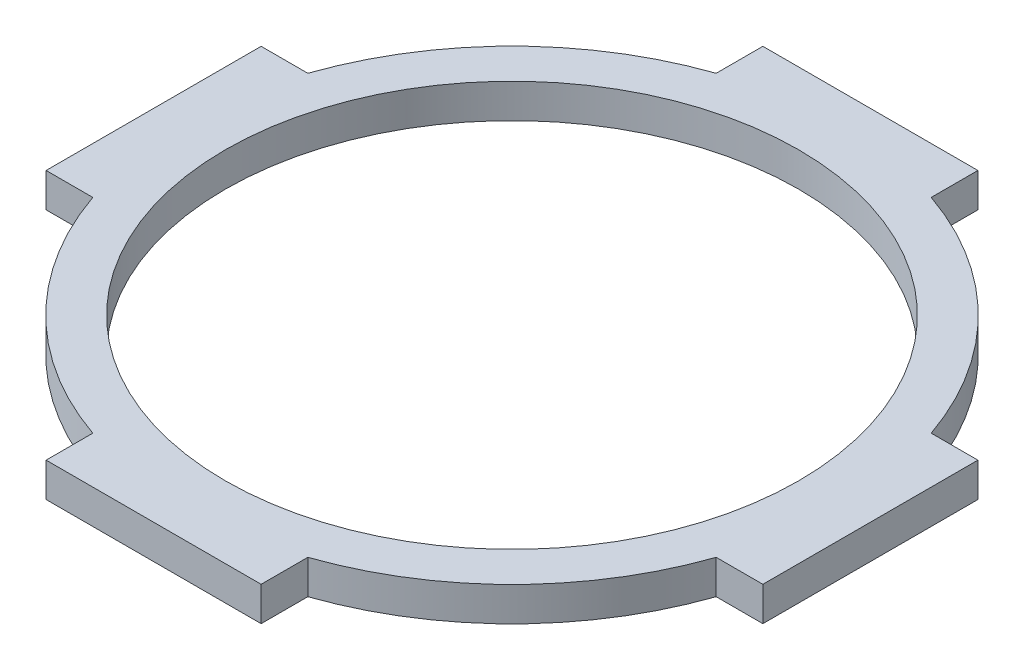
ISO-10303-21;
HEADER;
FILE_DESCRIPTION(('STEP AP214'),'2;1');
FILE_NAME('part.step','',(''),(''),'','','');
FILE_SCHEMA(('AUTOMOTIVE_DESIGN { 1 0 10303 214 1 1 1 1 }'));
ENDSEC;
DATA;
#1=APPLICATION_CONTEXT('core data for automotive mechanical design processes');
#2=APPLICATION_PROTOCOL_DEFINITION('international standard','automotive_design',2000,#1);
#3=PRODUCT_CONTEXT('',#1,'mechanical');
#4=PRODUCT('Part','Part','',(#3));
#5=PRODUCT_RELATED_PRODUCT_CATEGORY('part','',(#4));
#6=PRODUCT_DEFINITION_FORMATION('','',#4);
#7=PRODUCT_DEFINITION_CONTEXT('part definition',#1,'design');
#8=PRODUCT_DEFINITION('design','',#6,#7);
#9=PRODUCT_DEFINITION_SHAPE('','',#8);
#10=(LENGTH_UNIT() NAMED_UNIT(*) SI_UNIT(.MILLI.,.METRE.));
#11=(NAMED_UNIT(*) PLANE_ANGLE_UNIT() SI_UNIT($,.RADIAN.));
#12=(NAMED_UNIT(*) SI_UNIT($,.STERADIAN.) SOLID_ANGLE_UNIT());
#13=UNCERTAINTY_MEASURE_WITH_UNIT(LENGTH_MEASURE(1.E-05),#10,'distance_accuracy_value','');
#14=(GEOMETRIC_REPRESENTATION_CONTEXT(3) GLOBAL_UNCERTAINTY_ASSIGNED_CONTEXT((#13)) GLOBAL_UNIT_ASSIGNED_CONTEXT((#10,
#11,#12)) REPRESENTATION_CONTEXT('',''));
#15=CARTESIAN_POINT('',(0.,0.,0.));
#16=DIRECTION('',(0.,0.,1.));
#17=DIRECTION('',(1.,0.,0.));
#18=AXIS2_PLACEMENT_3D('',#15,#16,#17);
#19=CARTESIAN_POINT('',(0.,4.7625,0.));
#20=DIRECTION('',(0.,-1.,0.));
#21=DIRECTION('',(0.,0.,-1.));
#22=AXIS2_PLACEMENT_3D('',#19,#20,#21);
#23=CYLINDRICAL_SURFACE('',#22,46.);
#24=CARTESIAN_POINT('',(0.,4.7625,0.));
#25=DIRECTION('',(0.,1.,0.));
#26=DIRECTION('',(0.,0.,1.));
#27=AXIS2_PLACEMENT_3D('',#24,#25,#26);
#28=CIRCLE('',#27,46.);
#29=CARTESIAN_POINT('',(14.9999999999995,4.7625,43.485629810318));
#30=VERTEX_POINT('',#29);
#31=CARTESIAN_POINT('',(43.4856298103178,4.7625,15.));
#32=VERTEX_POINT('',#31);
#33=EDGE_CURVE('E43',#30,#32,#28,.T.);
#34=ORIENTED_EDGE('',*,*,#33,.F.);
#35=DIRECTION('',(0.,1.,0.));
#36=VECTOR('',#35,1.);
#37=CARTESIAN_POINT('',(14.9999999999995,-30.6991371046195,43.485629810318));
#38=LINE('',#37,#36);
#39=CARTESIAN_POINT('',(14.9999999999995,0.,43.485629810318));
#40=VERTEX_POINT('',#39);
#41=EDGE_CURVE('E178',#40,#30,#38,.T.);
#42=ORIENTED_EDGE('',*,*,#41,.F.);
#43=CARTESIAN_POINT('',(0.,0.,0.));
#44=DIRECTION('',(0.,1.,0.));
#45=DIRECTION('',(0.,0.,1.));
#46=AXIS2_PLACEMENT_3D('',#43,#44,#45);
#47=CIRCLE('',#46,46.);
#48=CARTESIAN_POINT('',(43.4856298103178,0.,15.));
#49=VERTEX_POINT('',#48);
#50=EDGE_CURVE('E315',#40,#49,#47,.T.);
#51=ORIENTED_EDGE('',*,*,#50,.T.);
#52=DIRECTION('',(0.,1.,0.));
#53=VECTOR('',#52,1.);
#54=CARTESIAN_POINT('',(43.4856298103178,-30.6991371046194,15.));
#55=LINE('',#54,#53);
#56=EDGE_CURVE('E199',#49,#32,#55,.T.);
#57=ORIENTED_EDGE('',*,*,#56,.T.);
#58=EDGE_LOOP('',(#34,#42,#51,#57));
#59=FACE_BOUND('',#58,.T.);
#60=ADVANCED_FACE('F34',(#59),#23,.T.);
#61=CARTESIAN_POINT('',(43.4856298103178,4.7625,-15.));
#62=VERTEX_POINT('',#61);
#63=CARTESIAN_POINT('',(15.0000000000002,4.7625,-43.4856298103177));
#64=VERTEX_POINT('',#63);
#65=EDGE_CURVE('E296',#62,#64,#28,.T.);
#66=ORIENTED_EDGE('',*,*,#65,.F.);
#67=DIRECTION('',(0.,1.,0.));
#68=VECTOR('',#67,1.);
#69=CARTESIAN_POINT('',(43.4856298103178,-30.6991371046194,-15.));
#70=LINE('',#69,#68);
#71=CARTESIAN_POINT('',(43.4856298103178,0.,-15.));
#72=VERTEX_POINT('',#71);
#73=EDGE_CURVE('E188',#72,#62,#70,.T.);
#74=ORIENTED_EDGE('',*,*,#73,.F.);
#75=CARTESIAN_POINT('',(15.0000000000002,0.,-43.4856298103177));
#76=VERTEX_POINT('',#75);
#77=EDGE_CURVE('E313',#72,#76,#47,.T.);
#78=ORIENTED_EDGE('',*,*,#77,.T.);
#79=DIRECTION('',(0.,1.,0.));
#80=VECTOR('',#79,1.);
#81=CARTESIAN_POINT('',(15.0000000000002,-30.6991371046194,-43.4856298103177));
#82=LINE('',#81,#80);
#83=EDGE_CURVE('E224',#76,#64,#82,.T.);
#84=ORIENTED_EDGE('',*,*,#83,.T.);
#85=EDGE_LOOP('',(#66,#74,#78,#84));
#86=FACE_BOUND('',#85,.T.);
#87=ADVANCED_FACE('F286',(#86),#23,.T.);
#88=CARTESIAN_POINT('',(-14.9999999999998,4.7625,-43.4856298103179));
#89=VERTEX_POINT('',#88);
#90=CARTESIAN_POINT('',(-43.4856298103178,4.7625,-15.));
#91=VERTEX_POINT('',#90);
#92=EDGE_CURVE('E44',#89,#91,#28,.T.);
#93=ORIENTED_EDGE('',*,*,#92,.F.);
#94=DIRECTION('',(0.,1.,0.));
#95=VECTOR('',#94,1.);
#96=CARTESIAN_POINT('',(-14.9999999999998,-30.6991371046194,-43.4856298103179));
#97=LINE('',#96,#95);
#98=CARTESIAN_POINT('',(-14.9999999999998,0.,-43.4856298103179));
#99=VERTEX_POINT('',#98);
#100=EDGE_CURVE('E213',#99,#89,#97,.T.);
#101=ORIENTED_EDGE('',*,*,#100,.F.);
#102=CARTESIAN_POINT('',(-43.4856298103178,0.,-15.));
#103=VERTEX_POINT('',#102);
#104=EDGE_CURVE('E264',#99,#103,#47,.T.);
#105=ORIENTED_EDGE('',*,*,#104,.T.);
#106=DIRECTION('',(0.,1.,0.));
#107=VECTOR('',#106,1.);
#108=CARTESIAN_POINT('',(-43.4856298103178,-30.6991371046194,-15.));
#109=LINE('',#108,#107);
#110=EDGE_CURVE('E249',#103,#91,#109,.T.);
#111=ORIENTED_EDGE('',*,*,#110,.T.);
#112=EDGE_LOOP('',(#93,#101,#105,#111));
#113=FACE_BOUND('',#112,.T.);
#114=ADVANCED_FACE('F282',(#113),#23,.T.);
#115=CARTESIAN_POINT('',(0.,4.7625,0.));
#116=DIRECTION('',(0.,1.,0.));
#117=DIRECTION('',(0.,0.,1.));
#118=AXIS2_PLACEMENT_3D('',#115,#116,#117);
#119=PLANE('',#118);
#120=CARTESIAN_POINT('',(-43.4856298103178,4.7625,15.));
#121=VERTEX_POINT('',#120);
#122=CARTESIAN_POINT('',(-15.0000000000005,4.7625,43.4856298103176));
#123=VERTEX_POINT('',#122);
#124=EDGE_CURVE('E11',#121,#123,#28,.T.);
#125=ORIENTED_EDGE('',*,*,#124,.T.);
#126=DIRECTION('',(0.,0.,1.));
#127=VECTOR('',#126,1.);
#128=CARTESIAN_POINT('',(-15.0000000000005,4.7625,43.4856298103176));
#129=LINE('',#128,#127);
#130=CARTESIAN_POINT('',(-15.0000000000005,4.7625,49.9999999999998));
#131=VERTEX_POINT('',#130);
#132=EDGE_CURVE('E153',#123,#131,#129,.T.);
#133=ORIENTED_EDGE('',*,*,#132,.T.);
#134=DIRECTION('',(1.,0.,0.));
#135=VECTOR('',#134,1.);
#136=CARTESIAN_POINT('',(-15.0000000000005,4.7625,49.9999999999998));
#137=LINE('',#136,#135);
#138=CARTESIAN_POINT('',(14.9999999999995,4.7625,50.0000000000002));
#139=VERTEX_POINT('',#138);
#140=EDGE_CURVE('E161',#131,#139,#137,.T.);
#141=ORIENTED_EDGE('',*,*,#140,.T.);
#142=DIRECTION('',(0.,0.,-1.));
#143=VECTOR('',#142,1.);
#144=CARTESIAN_POINT('',(14.9999999999995,4.7625,50.0000000000002));
#145=LINE('',#144,#143);
#146=EDGE_CURVE('E167',#139,#30,#145,.T.);
#147=ORIENTED_EDGE('',*,*,#146,.T.);
#148=ORIENTED_EDGE('',*,*,#33,.T.);
#149=DIRECTION('',(1.,0.,0.));
#150=VECTOR('',#149,1.);
#151=CARTESIAN_POINT('',(43.4856298103178,4.7625,15.));
#152=LINE('',#151,#150);
#153=CARTESIAN_POINT('',(50.,4.7625,15.));
#154=VERTEX_POINT('',#153);
#155=EDGE_CURVE('E184',#32,#154,#152,.T.);
#156=ORIENTED_EDGE('',*,*,#155,.T.);
#157=DIRECTION('',(0.,0.,-1.));
#158=VECTOR('',#157,1.);
#159=CARTESIAN_POINT('',(50.,4.7625,15.));
#160=LINE('',#159,#158);
#161=CARTESIAN_POINT('',(50.,4.7625,-15.));
#162=VERTEX_POINT('',#161);
#163=EDGE_CURVE('E193',#154,#162,#160,.T.);
#164=ORIENTED_EDGE('',*,*,#163,.T.);
#165=DIRECTION('',(-1.,0.,0.));
#166=VECTOR('',#165,1.);
#167=CARTESIAN_POINT('',(50.,4.7625,-15.));
#168=LINE('',#167,#166);
#169=EDGE_CURVE('E196',#162,#62,#168,.T.);
#170=ORIENTED_EDGE('',*,*,#169,.T.);
#171=ORIENTED_EDGE('',*,*,#65,.T.);
#172=DIRECTION('',(0.,0.,-1.));
#173=VECTOR('',#172,1.);
#174=CARTESIAN_POINT('',(15.0000000000002,4.7625,-43.4856298103177));
#175=LINE('',#174,#173);
#176=CARTESIAN_POINT('',(15.0000000000002,4.7625,-50.));
#177=VERTEX_POINT('',#176);
#178=EDGE_CURVE('E209',#64,#177,#175,.T.);
#179=ORIENTED_EDGE('',*,*,#178,.T.);
#180=DIRECTION('',(-1.,0.,0.));
#181=VECTOR('',#180,1.);
#182=CARTESIAN_POINT('',(15.0000000000002,4.7625,-50.));
#183=LINE('',#182,#181);
#184=CARTESIAN_POINT('',(-14.9999999999998,4.7625,-50.0000000000001));
#185=VERTEX_POINT('',#184);
#186=EDGE_CURVE('E218',#177,#185,#183,.T.);
#187=ORIENTED_EDGE('',*,*,#186,.T.);
#188=DIRECTION('',(0.,0.,1.));
#189=VECTOR('',#188,1.);
#190=CARTESIAN_POINT('',(-14.9999999999998,4.7625,-50.0000000000001));
#191=LINE('',#190,#189);
#192=EDGE_CURVE('E221',#185,#89,#191,.T.);
#193=ORIENTED_EDGE('',*,*,#192,.T.);
#194=ORIENTED_EDGE('',*,*,#92,.T.);
#195=DIRECTION('',(-1.,0.,0.));
#196=VECTOR('',#195,1.);
#197=CARTESIAN_POINT('',(-43.4856298103178,4.7625,-15.));
#198=LINE('',#197,#196);
#199=CARTESIAN_POINT('',(-50.,4.7625,-15.));
#200=VERTEX_POINT('',#199);
#201=EDGE_CURVE('E235',#91,#200,#198,.T.);
#202=ORIENTED_EDGE('',*,*,#201,.T.);
#203=DIRECTION('',(0.,0.,1.));
#204=VECTOR('',#203,1.);
#205=CARTESIAN_POINT('',(-50.,4.7625,-15.));
#206=LINE('',#205,#204);
#207=CARTESIAN_POINT('',(-50.,4.7625,15.));
#208=VERTEX_POINT('',#207);
#209=EDGE_CURVE('E244',#200,#208,#206,.T.);
#210=ORIENTED_EDGE('',*,*,#209,.T.);
#211=DIRECTION('',(1.,0.,0.));
#212=VECTOR('',#211,1.);
#213=CARTESIAN_POINT('',(-50.,4.7625,15.));
#214=LINE('',#213,#212);
#215=EDGE_CURVE('E247',#208,#121,#214,.T.);
#216=ORIENTED_EDGE('',*,*,#215,.T.);
#217=EDGE_LOOP('',(#125,#133,#141,#147,#148,#156,#164,#170,#171,#179,#187,#193,#194,#202,#210,#216));
#218=FACE_BOUND('',#217,.T.);
#219=CARTESIAN_POINT('',(0.,4.7625,0.));
#220=DIRECTION('',(0.,1.,0.));
#221=DIRECTION('',(0.,0.,1.));
#222=AXIS2_PLACEMENT_3D('',#219,#220,#221);
#223=CIRCLE('',#222,40.);
#224=CARTESIAN_POINT('',(0.,4.7625,-40.));
#225=VERTEX_POINT('',#224);
#226=EDGE_CURVE('E261',#225,#225,#223,.T.);
#227=ORIENTED_EDGE('',*,*,#226,.F.);
#228=EDGE_LOOP('',(#227));
#229=FACE_BOUND('',#228,.T.);
#230=ADVANCED_FACE('F169',(#218,#229),#119,.T.);
#231=CARTESIAN_POINT('',(0.,0.,0.));
#232=DIRECTION('',(0.,1.,0.));
#233=DIRECTION('',(0.,0.,1.));
#234=AXIS2_PLACEMENT_3D('',#231,#232,#233);
#235=PLANE('',#234);
#236=CARTESIAN_POINT('',(-43.4856298103178,0.,15.));
#237=VERTEX_POINT('',#236);
#238=CARTESIAN_POINT('',(-15.0000000000005,0.,43.4856298103176));
#239=VERTEX_POINT('',#238);
#240=EDGE_CURVE('E38',#237,#239,#47,.T.);
#241=ORIENTED_EDGE('',*,*,#240,.F.);
#242=DIRECTION('',(-1.,0.,0.));
#243=VECTOR('',#242,1.);
#244=CARTESIAN_POINT('',(-50.,0.,15.));
#245=LINE('',#244,#243);
#246=CARTESIAN_POINT('',(-50.,0.,15.));
#247=VERTEX_POINT('',#246);
#248=EDGE_CURVE('E238',#237,#247,#245,.T.);
#249=ORIENTED_EDGE('',*,*,#248,.T.);
#250=DIRECTION('',(0.,0.,-1.));
#251=VECTOR('',#250,1.);
#252=CARTESIAN_POINT('',(-50.,0.,-15.));
#253=LINE('',#252,#251);
#254=CARTESIAN_POINT('',(-50.,0.,-15.));
#255=VERTEX_POINT('',#254);
#256=EDGE_CURVE('E236',#247,#255,#253,.T.);
#257=ORIENTED_EDGE('',*,*,#256,.T.);
#258=DIRECTION('',(1.,0.,0.));
#259=VECTOR('',#258,1.);
#260=CARTESIAN_POINT('',(-43.4856298103178,0.,-15.));
#261=LINE('',#260,#259);
#262=EDGE_CURVE('E241',#255,#103,#261,.T.);
#263=ORIENTED_EDGE('',*,*,#262,.T.);
#264=ORIENTED_EDGE('',*,*,#104,.F.);
#265=DIRECTION('',(0.,0.,-1.));
#266=VECTOR('',#265,1.);
#267=CARTESIAN_POINT('',(-14.9999999999998,0.,-50.0000000000001));
#268=LINE('',#267,#266);
#269=CARTESIAN_POINT('',(-14.9999999999998,0.,-50.));
#270=VERTEX_POINT('',#269);
#271=EDGE_CURVE('E212',#99,#270,#268,.T.);
#272=ORIENTED_EDGE('',*,*,#271,.T.);
#273=DIRECTION('',(1.,0.,0.));
#274=VECTOR('',#273,1.);
#275=CARTESIAN_POINT('',(15.0000000000002,0.,-50.));
#276=LINE('',#275,#274);
#277=CARTESIAN_POINT('',(15.0000000000002,0.,-50.));
#278=VERTEX_POINT('',#277);
#279=EDGE_CURVE('E210',#270,#278,#276,.T.);
#280=ORIENTED_EDGE('',*,*,#279,.T.);
#281=DIRECTION('',(0.,0.,1.));
#282=VECTOR('',#281,1.);
#283=CARTESIAN_POINT('',(15.0000000000002,0.,-43.4856298103177));
#284=LINE('',#283,#282);
#285=EDGE_CURVE('E215',#278,#76,#284,.T.);
#286=ORIENTED_EDGE('',*,*,#285,.T.);
#287=ORIENTED_EDGE('',*,*,#77,.F.);
#288=DIRECTION('',(1.,0.,0.));
#289=VECTOR('',#288,1.);
#290=CARTESIAN_POINT('',(50.,0.,-15.));
#291=LINE('',#290,#289);
#292=CARTESIAN_POINT('',(50.,0.,-15.));
#293=VERTEX_POINT('',#292);
#294=EDGE_CURVE('E187',#72,#293,#291,.T.);
#295=ORIENTED_EDGE('',*,*,#294,.T.);
#296=DIRECTION('',(0.,0.,1.));
#297=VECTOR('',#296,1.);
#298=CARTESIAN_POINT('',(50.,0.,15.));
#299=LINE('',#298,#297);
#300=CARTESIAN_POINT('',(50.,0.,15.));
#301=VERTEX_POINT('',#300);
#302=EDGE_CURVE('E185',#293,#301,#299,.T.);
#303=ORIENTED_EDGE('',*,*,#302,.T.);
#304=DIRECTION('',(-1.,0.,0.));
#305=VECTOR('',#304,1.);
#306=CARTESIAN_POINT('',(43.4856298103178,0.,15.));
#307=LINE('',#306,#305);
#308=EDGE_CURVE('E190',#301,#49,#307,.T.);
#309=ORIENTED_EDGE('',*,*,#308,.T.);
#310=ORIENTED_EDGE('',*,*,#50,.F.);
#311=DIRECTION('',(0.,0.,1.));
#312=VECTOR('',#311,1.);
#313=CARTESIAN_POINT('',(14.9999999999995,0.,50.0000000000002));
#314=LINE('',#313,#312);
#315=CARTESIAN_POINT('',(14.9999999999995,0.,50.0000000000002));
#316=VERTEX_POINT('',#315);
#317=EDGE_CURVE('E174',#40,#316,#314,.T.);
#318=ORIENTED_EDGE('',*,*,#317,.T.);
#319=DIRECTION('',(-1.,0.,0.));
#320=VECTOR('',#319,1.);
#321=CARTESIAN_POINT('',(-15.0000000000005,0.,49.9999999999998));
#322=LINE('',#321,#320);
#323=CARTESIAN_POINT('',(-15.0000000000005,0.,49.9999999999998));
#324=VERTEX_POINT('',#323);
#325=EDGE_CURVE('E180',#316,#324,#322,.T.);
#326=ORIENTED_EDGE('',*,*,#325,.T.);
#327=DIRECTION('',(0.,0.,-1.));
#328=VECTOR('',#327,1.);
#329=CARTESIAN_POINT('',(-15.0000000000005,0.,43.4856298103176));
#330=LINE('',#329,#328);
#331=EDGE_CURVE('E155',#324,#239,#330,.T.);
#332=ORIENTED_EDGE('',*,*,#331,.T.);
#333=EDGE_LOOP('',(#241,#249,#257,#263,#264,#272,#280,#286,#287,#295,#303,#309,#310,#318,#326,#332));
#334=FACE_BOUND('',#333,.T.);
#335=CARTESIAN_POINT('',(0.,0.,0.));
#336=DIRECTION('',(0.,1.,0.));
#337=DIRECTION('',(0.,0.,1.));
#338=AXIS2_PLACEMENT_3D('',#335,#336,#337);
#339=CIRCLE('',#338,40.);
#340=CARTESIAN_POINT('',(0.,0.,-40.));
#341=VERTEX_POINT('',#340);
#342=EDGE_CURVE('E260',#341,#341,#339,.T.);
#343=ORIENTED_EDGE('',*,*,#342,.T.);
#344=EDGE_LOOP('',(#343));
#345=FACE_BOUND('',#344,.T.);
#346=ADVANCED_FACE('F268',(#334,#345),#235,.F.);
#347=ORIENTED_EDGE('',*,*,#240,.T.);
#348=DIRECTION('',(0.,1.,0.));
#349=VECTOR('',#348,1.);
#350=CARTESIAN_POINT('',(-15.0000000000005,-30.6991371046195,43.4856298103176));
#351=LINE('',#350,#349);
#352=EDGE_CURVE('E58',#239,#123,#351,.T.);
#353=ORIENTED_EDGE('',*,*,#352,.T.);
#354=ORIENTED_EDGE('',*,*,#124,.F.);
#355=DIRECTION('',(0.,1.,0.));
#356=VECTOR('',#355,1.);
#357=CARTESIAN_POINT('',(-43.4856298103178,-30.6991371046194,15.));
#358=LINE('',#357,#356);
#359=EDGE_CURVE('E239',#237,#121,#358,.T.);
#360=ORIENTED_EDGE('',*,*,#359,.F.);
#361=EDGE_LOOP('',(#347,#353,#354,#360));
#362=FACE_BOUND('',#361,.T.);
#363=ADVANCED_FACE('F36',(#362),#23,.T.);
#364=CARTESIAN_POINT('',(0.,4.7625,0.));
#365=DIRECTION('',(0.,-1.,0.));
#366=DIRECTION('',(0.,0.,-1.));
#367=AXIS2_PLACEMENT_3D('',#364,#365,#366);
#368=CYLINDRICAL_SURFACE('',#367,40.);
#369=CARTESIAN_POINT('',(0.,4.7625,-40.));
#370=CARTESIAN_POINT('',(0.,4.712890625,-40.));
#371=CARTESIAN_POINT('',(0.,4.66328125,-40.));
#372=CARTESIAN_POINT('',(0.,4.5640625,-40.));
#373=CARTESIAN_POINT('',(0.,4.514453125,-40.));
#374=CARTESIAN_POINT('',(0.,4.415234375,-40.));
#375=CARTESIAN_POINT('',(0.,4.365625,-40.));
#376=CARTESIAN_POINT('',(0.,4.26640625,-40.));
#377=CARTESIAN_POINT('',(0.,4.216796875,-40.));
#378=CARTESIAN_POINT('',(0.,4.117578125,-40.));
#379=CARTESIAN_POINT('',(0.,4.06796875,-40.));
#380=CARTESIAN_POINT('',(0.,3.96875,-40.));
#381=CARTESIAN_POINT('',(0.,3.919140625,-40.));
#382=CARTESIAN_POINT('',(0.,3.819921875,-40.));
#383=CARTESIAN_POINT('',(0.,3.7703125,-40.));
#384=CARTESIAN_POINT('',(0.,3.67109375,-40.));
#385=CARTESIAN_POINT('',(0.,3.621484375,-40.));
#386=CARTESIAN_POINT('',(0.,3.522265625,-40.));
#387=CARTESIAN_POINT('',(0.,3.47265625,-40.));
#388=CARTESIAN_POINT('',(0.,3.3734375,-40.));
#389=CARTESIAN_POINT('',(0.,3.323828125,-40.));
#390=CARTESIAN_POINT('',(0.,3.224609375,-40.));
#391=CARTESIAN_POINT('',(0.,3.175,-40.));
#392=CARTESIAN_POINT('',(0.,3.07578125,-40.));
#393=CARTESIAN_POINT('',(0.,3.026171875,-40.));
#394=CARTESIAN_POINT('',(0.,2.926953125,-40.));
#395=CARTESIAN_POINT('',(0.,2.87734375,-40.));
#396=CARTESIAN_POINT('',(0.,2.778125,-40.));
#397=CARTESIAN_POINT('',(0.,2.728515625,-40.));
#398=CARTESIAN_POINT('',(0.,2.629296875,-40.));
#399=CARTESIAN_POINT('',(0.,2.5796875,-40.));
#400=CARTESIAN_POINT('',(0.,2.48046875,-40.));
#401=CARTESIAN_POINT('',(0.,2.430859375,-40.));
#402=CARTESIAN_POINT('',(0.,2.331640625,-40.));
#403=CARTESIAN_POINT('',(0.,2.28203125,-40.));
#404=CARTESIAN_POINT('',(0.,2.1828125,-40.));
#405=CARTESIAN_POINT('',(0.,2.133203125,-40.));
#406=CARTESIAN_POINT('',(0.,2.033984375,-40.));
#407=CARTESIAN_POINT('',(0.,1.984375,-40.));
#408=CARTESIAN_POINT('',(0.,1.88515625,-40.));
#409=CARTESIAN_POINT('',(0.,1.835546875,-40.));
#410=CARTESIAN_POINT('',(0.,1.736328125,-40.));
#411=CARTESIAN_POINT('',(0.,1.68671875,-40.));
#412=CARTESIAN_POINT('',(0.,1.5875,-40.));
#413=CARTESIAN_POINT('',(0.,1.537890625,-40.));
#414=CARTESIAN_POINT('',(0.,1.438671875,-40.));
#415=CARTESIAN_POINT('',(0.,1.3890625,-40.));
#416=CARTESIAN_POINT('',(0.,1.28984375,-40.));
#417=CARTESIAN_POINT('',(0.,1.240234375,-40.));
#418=CARTESIAN_POINT('',(0.,1.141015625,-40.));
#419=CARTESIAN_POINT('',(0.,1.09140625,-40.));
#420=CARTESIAN_POINT('',(0.,0.9921875,-40.));
#421=CARTESIAN_POINT('',(0.,0.942578125,-40.));
#422=CARTESIAN_POINT('',(0.,0.843359375,-40.));
#423=CARTESIAN_POINT('',(0.,0.79375,-40.));
#424=CARTESIAN_POINT('',(0.,0.69453125,-40.));
#425=CARTESIAN_POINT('',(0.,0.644921875,-40.));
#426=CARTESIAN_POINT('',(0.,0.545703125,-40.));
#427=CARTESIAN_POINT('',(0.,0.49609375,-40.));
#428=CARTESIAN_POINT('',(0.,0.396875,-40.));
#429=CARTESIAN_POINT('',(0.,0.347265625,-40.));
#430=CARTESIAN_POINT('',(0.,0.248046875,-40.));
#431=CARTESIAN_POINT('',(0.,0.1984375,-40.));
#432=CARTESIAN_POINT('',(0.,0.09921875,-40.));
#433=CARTESIAN_POINT('',(0.,0.049609375,-40.));
#434=CARTESIAN_POINT('',(0.,0.,-40.));
#435=B_SPLINE_CURVE_WITH_KNOTS('',3,(#369,#370,#371,#372,#373,#374,#375,#376,#377,#378,#379,
#380,#381,#382,#383,#384,#385,#386,#387,#388,#389,#390,#391,#392,#393,#394,#395,#396,#397,#398,
#399,#400,#401,#402,#403,#404,#405,#406,#407,#408,#409,#410,#411,#412,#413,#414,#415,#416,#417,
#418,#419,#420,#421,#422,#423,#424,#425,#426,#427,#428,#429,#430,#431,#432,#433,#434),
.UNSPECIFIED.,.F.,.F.,(4,2,2,2,2,2,2,2,2,2,2,2,2,2,2,2,2,2,2,2,2,2,2,2,2,2,2,2,2,2,2,2,4),(0.,
0.148828124999999,0.297656249999999,0.446484374999999,0.595312499999999,0.744140625,0.89296875,
1.041796875,1.190625,1.339453125,1.48828125,1.637109375,1.7859375,1.934765625,2.08359375,
2.232421875,2.38125,2.530078125,2.67890625,2.827734375,2.9765625,3.125390625,3.27421875,
3.423046875,3.571875,3.720703125,3.86953125,4.018359375,4.1671875,4.316015625,4.46484375,
4.613671875,4.7625),.UNSPECIFIED.);
#436=EDGE_CURVE('BSEAM270',#225,#341,#435,.T.);
#437=ORIENTED_EDGE('',*,*,#226,.T.);
#438=ORIENTED_EDGE('',*,*,#342,.F.);
#439=ORIENTED_EDGE('',*,*,#436,.T.);
#440=ORIENTED_EDGE('',*,*,#436,.F.);
#441=EDGE_LOOP('',(#437,#439,#438,#440));
#442=FACE_BOUND('',#441,.T.);
#443=ADVANCED_FACE('F270',(#442),#368,.F.);
#444=CARTESIAN_POINT('',(-50.,-30.6991371046194,15.));
#445=DIRECTION('',(0.,0.,1.));
#446=DIRECTION('',(1.,0.,0.));
#447=AXIS2_PLACEMENT_3D('',#444,#445,#446);
#448=PLANE('',#447);
#449=ORIENTED_EDGE('',*,*,#248,.F.);
#450=ORIENTED_EDGE('',*,*,#359,.T.);
#451=ORIENTED_EDGE('',*,*,#215,.F.);
#452=DIRECTION('',(0.,1.,0.));
#453=VECTOR('',#452,1.);
#454=CARTESIAN_POINT('',(-50.,-30.6991371046194,15.));
#455=LINE('',#454,#453);
#456=EDGE_CURVE('E252',#247,#208,#455,.T.);
#457=ORIENTED_EDGE('',*,*,#456,.F.);
#458=EDGE_LOOP('',(#449,#450,#451,#457));
#459=FACE_BOUND('',#458,.T.);
#460=ADVANCED_FACE('F272',(#459),#448,.T.);
#461=CARTESIAN_POINT('',(-50.,-30.6991371046194,-15.));
#462=DIRECTION('',(-1.,0.,0.));
#463=DIRECTION('',(0.,0.,1.));
#464=AXIS2_PLACEMENT_3D('',#461,#462,#463);
#465=PLANE('',#464);
#466=ORIENTED_EDGE('',*,*,#256,.F.);
#467=ORIENTED_EDGE('',*,*,#456,.T.);
#468=ORIENTED_EDGE('',*,*,#209,.F.);
#469=DIRECTION('',(0.,1.,0.));
#470=VECTOR('',#469,1.);
#471=CARTESIAN_POINT('',(-50.,-30.6991371046194,-15.));
#472=LINE('',#471,#470);
#473=EDGE_CURVE('E254',#255,#200,#472,.T.);
#474=ORIENTED_EDGE('',*,*,#473,.F.);
#475=EDGE_LOOP('',(#466,#467,#468,#474));
#476=FACE_BOUND('',#475,.T.);
#477=ADVANCED_FACE('F279',(#476),#465,.T.);
#478=CARTESIAN_POINT('',(-43.4856298103178,-30.6991371046194,-15.));
#479=DIRECTION('',(0.,0.,-1.));
#480=DIRECTION('',(-1.,0.,0.));
#481=AXIS2_PLACEMENT_3D('',#478,#479,#480);
#482=PLANE('',#481);
#483=ORIENTED_EDGE('',*,*,#262,.F.);
#484=ORIENTED_EDGE('',*,*,#473,.T.);
#485=ORIENTED_EDGE('',*,*,#201,.F.);
#486=ORIENTED_EDGE('',*,*,#110,.F.);
#487=EDGE_LOOP('',(#483,#484,#485,#486));
#488=FACE_BOUND('',#487,.T.);
#489=ADVANCED_FACE('F323',(#488),#482,.T.);
#490=CARTESIAN_POINT('',(-14.9999999999998,-30.6991371046194,-50.0000000000001));
#491=DIRECTION('',(-1.,0.,0.));
#492=DIRECTION('',(0.,0.,1.));
#493=AXIS2_PLACEMENT_3D('',#490,#491,#492);
#494=PLANE('',#493);
#495=ORIENTED_EDGE('',*,*,#271,.F.);
#496=ORIENTED_EDGE('',*,*,#100,.T.);
#497=ORIENTED_EDGE('',*,*,#192,.F.);
#498=DIRECTION('',(0.,1.,0.));
#499=VECTOR('',#498,1.);
#500=CARTESIAN_POINT('',(-14.9999999999998,-30.6991371046194,-50.0000000000001));
#501=LINE('',#500,#499);
#502=EDGE_CURVE('E227',#270,#185,#501,.T.);
#503=ORIENTED_EDGE('',*,*,#502,.F.);
#504=EDGE_LOOP('',(#495,#496,#497,#503));
#505=FACE_BOUND('',#504,.T.);
#506=ADVANCED_FACE('F346',(#505),#494,.T.);
#507=CARTESIAN_POINT('',(15.0000000000002,-30.6991371046194,-50.));
#508=DIRECTION('',(0.,0.,-1.));
#509=DIRECTION('',(-1.,0.,0.));
#510=AXIS2_PLACEMENT_3D('',#507,#508,#509);
#511=PLANE('',#510);
#512=ORIENTED_EDGE('',*,*,#279,.F.);
#513=ORIENTED_EDGE('',*,*,#502,.T.);
#514=ORIENTED_EDGE('',*,*,#186,.F.);
#515=DIRECTION('',(0.,1.,0.));
#516=VECTOR('',#515,1.);
#517=CARTESIAN_POINT('',(15.0000000000002,-30.6991371046194,-50.));
#518=LINE('',#517,#516);
#519=EDGE_CURVE('E229',#278,#177,#518,.T.);
#520=ORIENTED_EDGE('',*,*,#519,.F.);
#521=EDGE_LOOP('',(#512,#513,#514,#520));
#522=FACE_BOUND('',#521,.T.);
#523=ADVANCED_FACE('F349',(#522),#511,.T.);
#524=CARTESIAN_POINT('',(15.0000000000002,-30.6991371046194,-43.4856298103177));
#525=DIRECTION('',(1.,0.,0.));
#526=DIRECTION('',(0.,0.,-1.));
#527=AXIS2_PLACEMENT_3D('',#524,#525,#526);
#528=PLANE('',#527);
#529=ORIENTED_EDGE('',*,*,#285,.F.);
#530=ORIENTED_EDGE('',*,*,#519,.T.);
#531=ORIENTED_EDGE('',*,*,#178,.F.);
#532=ORIENTED_EDGE('',*,*,#83,.F.);
#533=EDGE_LOOP('',(#529,#530,#531,#532));
#534=FACE_BOUND('',#533,.T.);
#535=ADVANCED_FACE('F353',(#534),#528,.T.);
#536=CARTESIAN_POINT('',(50.,-30.6991371046194,-15.));
#537=DIRECTION('',(0.,0.,-1.));
#538=DIRECTION('',(-1.,0.,0.));
#539=AXIS2_PLACEMENT_3D('',#536,#537,#538);
#540=PLANE('',#539);
#541=ORIENTED_EDGE('',*,*,#294,.F.);
#542=ORIENTED_EDGE('',*,*,#73,.T.);
#543=ORIENTED_EDGE('',*,*,#169,.F.);
#544=DIRECTION('',(0.,1.,0.));
#545=VECTOR('',#544,1.);
#546=CARTESIAN_POINT('',(50.,-30.6991371046194,-15.));
#547=LINE('',#546,#545);
#548=EDGE_CURVE('E202',#293,#162,#547,.T.);
#549=ORIENTED_EDGE('',*,*,#548,.F.);
#550=EDGE_LOOP('',(#541,#542,#543,#549));
#551=FACE_BOUND('',#550,.T.);
#552=ADVANCED_FACE('F302',(#551),#540,.T.);
#553=CARTESIAN_POINT('',(50.,-30.6991371046194,15.));
#554=DIRECTION('',(1.,0.,0.));
#555=DIRECTION('',(0.,0.,-1.));
#556=AXIS2_PLACEMENT_3D('',#553,#554,#555);
#557=PLANE('',#556);
#558=ORIENTED_EDGE('',*,*,#302,.F.);
#559=ORIENTED_EDGE('',*,*,#548,.T.);
#560=ORIENTED_EDGE('',*,*,#163,.F.);
#561=DIRECTION('',(0.,1.,0.));
#562=VECTOR('',#561,1.);
#563=CARTESIAN_POINT('',(50.,-30.6991371046194,15.));
#564=LINE('',#563,#562);
#565=EDGE_CURVE('E204',#301,#154,#564,.T.);
#566=ORIENTED_EDGE('',*,*,#565,.F.);
#567=EDGE_LOOP('',(#558,#559,#560,#566));
#568=FACE_BOUND('',#567,.T.);
#569=ADVANCED_FACE('F309',(#568),#557,.T.);
#570=CARTESIAN_POINT('',(43.4856298103178,-30.6991371046194,15.));
#571=DIRECTION('',(0.,0.,1.));
#572=DIRECTION('',(1.,0.,0.));
#573=AXIS2_PLACEMENT_3D('',#570,#571,#572);
#574=PLANE('',#573);
#575=ORIENTED_EDGE('',*,*,#308,.F.);
#576=ORIENTED_EDGE('',*,*,#565,.T.);
#577=ORIENTED_EDGE('',*,*,#155,.F.);
#578=ORIENTED_EDGE('',*,*,#56,.F.);
#579=EDGE_LOOP('',(#575,#576,#577,#578));
#580=FACE_BOUND('',#579,.T.);
#581=ADVANCED_FACE('F335',(#580),#574,.T.);
#582=CARTESIAN_POINT('',(14.9999999999995,-30.6991371046195,50.0000000000002));
#583=DIRECTION('',(1.,0.,0.));
#584=DIRECTION('',(0.,0.,-1.));
#585=AXIS2_PLACEMENT_3D('',#582,#583,#584);
#586=PLANE('',#585);
#587=ORIENTED_EDGE('',*,*,#317,.F.);
#588=ORIENTED_EDGE('',*,*,#41,.T.);
#589=ORIENTED_EDGE('',*,*,#146,.F.);
#590=DIRECTION('',(0.,1.,0.));
#591=VECTOR('',#590,1.);
#592=CARTESIAN_POINT('',(14.9999999999995,-30.6991371046195,50.0000000000002));
#593=LINE('',#592,#591);
#594=EDGE_CURVE('E158',#316,#139,#593,.T.);
#595=ORIENTED_EDGE('',*,*,#594,.F.);
#596=EDGE_LOOP('',(#587,#588,#589,#595));
#597=FACE_BOUND('',#596,.T.);
#598=ADVANCED_FACE('F333',(#597),#586,.T.);
#599=CARTESIAN_POINT('',(-15.0000000000005,-30.6991371046195,49.9999999999998));
#600=DIRECTION('',(0.,0.,1.));
#601=DIRECTION('',(1.,0.,0.));
#602=AXIS2_PLACEMENT_3D('',#599,#600,#601);
#603=PLANE('',#602);
#604=ORIENTED_EDGE('',*,*,#325,.F.);
#605=ORIENTED_EDGE('',*,*,#594,.T.);
#606=ORIENTED_EDGE('',*,*,#140,.F.);
#607=DIRECTION('',(0.,1.,0.));
#608=VECTOR('',#607,1.);
#609=CARTESIAN_POINT('',(-15.0000000000005,-30.6991371046195,49.9999999999998));
#610=LINE('',#609,#608);
#611=EDGE_CURVE('E149',#324,#131,#610,.T.);
#612=ORIENTED_EDGE('',*,*,#611,.F.);
#613=EDGE_LOOP('',(#604,#605,#606,#612));
#614=FACE_BOUND('',#613,.T.);
#615=ADVANCED_FACE('F162',(#614),#603,.T.);
#616=CARTESIAN_POINT('',(-15.0000000000005,-30.6991371046195,43.4856298103176));
#617=DIRECTION('',(-1.,0.,0.));
#618=DIRECTION('',(0.,0.,1.));
#619=AXIS2_PLACEMENT_3D('',#616,#617,#618);
#620=PLANE('',#619);
#621=ORIENTED_EDGE('',*,*,#331,.F.);
#622=ORIENTED_EDGE('',*,*,#611,.T.);
#623=ORIENTED_EDGE('',*,*,#132,.F.);
#624=ORIENTED_EDGE('',*,*,#352,.F.);
#625=EDGE_LOOP('',(#621,#622,#623,#624));
#626=FACE_BOUND('',#625,.T.);
#627=ADVANCED_FACE('F151',(#626),#620,.T.);
#628=CLOSED_SHELL('',(#60,#87,#114,#230,#346,#363,#443,#460,#477,#489,#506,#523,#535,#552,#569,
#581,#598,#615,#627));
#629=MANIFOLD_SOLID_BREP('B2',#628);
#630=ADVANCED_BREP_SHAPE_REPRESENTATION('',(#18,#629),#14);
#631=SHAPE_DEFINITION_REPRESENTATION(#9,#630);
ENDSEC;
END-ISO-10303-21;
